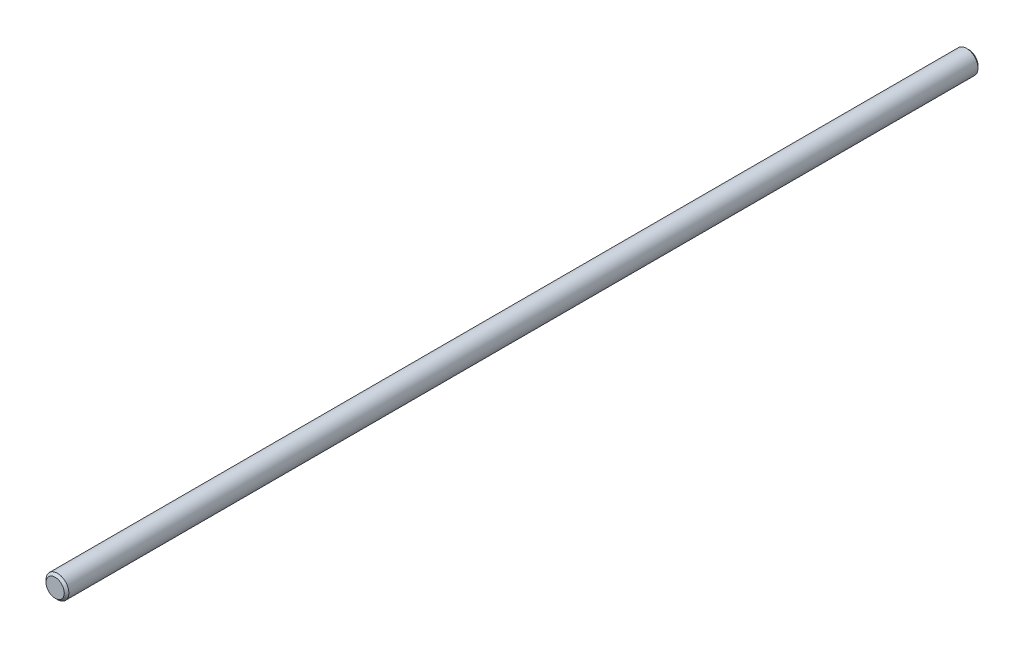
ISO-10303-21;
HEADER;
FILE_DESCRIPTION(('STEP AP214'),'2;1');
FILE_NAME('part.step','',(''),(''),'','','');
FILE_SCHEMA(('AUTOMOTIVE_DESIGN { 1 0 10303 214 1 1 1 1 }'));
ENDSEC;
DATA;
#1=APPLICATION_CONTEXT('core data for automotive mechanical design processes');
#2=APPLICATION_PROTOCOL_DEFINITION('international standard','automotive_design',2000,#1);
#3=PRODUCT_CONTEXT('',#1,'mechanical');
#4=PRODUCT('Part','Part','',(#3));
#5=PRODUCT_RELATED_PRODUCT_CATEGORY('part','',(#4));
#6=PRODUCT_DEFINITION_FORMATION('','',#4);
#7=PRODUCT_DEFINITION_CONTEXT('part definition',#1,'design');
#8=PRODUCT_DEFINITION('design','',#6,#7);
#9=PRODUCT_DEFINITION_SHAPE('','',#8);
#10=(LENGTH_UNIT() NAMED_UNIT(*) SI_UNIT(.MILLI.,.METRE.));
#11=(NAMED_UNIT(*) PLANE_ANGLE_UNIT() SI_UNIT($,.RADIAN.));
#12=(NAMED_UNIT(*) SI_UNIT($,.STERADIAN.) SOLID_ANGLE_UNIT());
#13=UNCERTAINTY_MEASURE_WITH_UNIT(LENGTH_MEASURE(1.E-05),#10,'distance_accuracy_value','');
#14=(GEOMETRIC_REPRESENTATION_CONTEXT(3) GLOBAL_UNCERTAINTY_ASSIGNED_CONTEXT((#13)) GLOBAL_UNIT_ASSIGNED_CONTEXT((#10,
#11,#12)) REPRESENTATION_CONTEXT('',''));
#15=CARTESIAN_POINT('',(0.,0.,0.));
#16=DIRECTION('',(0.,0.,1.));
#17=DIRECTION('',(1.,0.,0.));
#18=AXIS2_PLACEMENT_3D('',#15,#16,#17);
#19=CARTESIAN_POINT('',(0.,0.,63.5));
#20=DIRECTION('',(0.,0.,-1.));
#21=DIRECTION('',(-1.,0.,0.));
#22=AXIS2_PLACEMENT_3D('',#19,#20,#21);
#23=CYLINDRICAL_SURFACE('',#22,1.5875);
#24=CARTESIAN_POINT('',(0.,0.,-63.1825));
#25=DIRECTION('',(0.,0.,1.));
#26=DIRECTION('',(1.,0.,0.));
#27=AXIS2_PLACEMENT_3D('',#24,#25,#26);
#28=CIRCLE('',#27,1.5875);
#29=CARTESIAN_POINT('',(1.5875,0.,-63.1825));
#30=VERTEX_POINT('',#29);
#31=EDGE_CURVE('E48',#30,#30,#28,.T.);
#32=ORIENTED_EDGE('',*,*,#31,.T.);
#33=EDGE_LOOP('',(#32));
#34=FACE_BOUND('',#33,.T.);
#35=CARTESIAN_POINT('',(0.,0.,63.1825));
#36=DIRECTION('',(0.,0.,1.));
#37=DIRECTION('',(1.,0.,0.));
#38=AXIS2_PLACEMENT_3D('',#35,#36,#37);
#39=CIRCLE('',#38,1.5875);
#40=CARTESIAN_POINT('',(1.5875,0.,63.1825));
#41=VERTEX_POINT('',#40);
#42=EDGE_CURVE('E52',#41,#41,#39,.F.);
#43=ORIENTED_EDGE('',*,*,#42,.T.);
#44=EDGE_LOOP('',(#43));
#45=FACE_BOUND('',#44,.T.);
#46=ADVANCED_FACE('F37',(#34,#45),#23,.T.);
#47=CARTESIAN_POINT('',(0.,0.,63.5));
#48=DIRECTION('',(0.,0.,1.));
#49=DIRECTION('',(1.,0.,0.));
#50=AXIS2_PLACEMENT_3D('',#47,#48,#49);
#51=PLANE('',#50);
#52=CARTESIAN_POINT('',(0.,0.,63.5));
#53=DIRECTION('',(0.,0.,1.));
#54=DIRECTION('',(1.,0.,0.));
#55=AXIS2_PLACEMENT_3D('',#52,#53,#54);
#56=CIRCLE('',#55,1.27000000000002);
#57=CARTESIAN_POINT('',(1.27000000000002,0.,63.5));
#58=VERTEX_POINT('',#57);
#59=EDGE_CURVE('E10',#58,#58,#56,.T.);
#60=ORIENTED_EDGE('',*,*,#59,.T.);
#61=EDGE_LOOP('',(#60));
#62=FACE_BOUND('',#61,.T.);
#63=ADVANCED_FACE('F68',(#62),#51,.T.);
#64=CARTESIAN_POINT('',(0.,0.,-63.5));
#65=DIRECTION('',(0.,0.,1.));
#66=DIRECTION('',(1.,0.,0.));
#67=AXIS2_PLACEMENT_3D('',#64,#65,#66);
#68=PLANE('',#67);
#69=CARTESIAN_POINT('',(0.,0.,-63.5));
#70=DIRECTION('',(0.,0.,1.));
#71=DIRECTION('',(1.,0.,0.));
#72=AXIS2_PLACEMENT_3D('',#69,#70,#71);
#73=CIRCLE('',#72,1.26999999999997);
#74=CARTESIAN_POINT('',(1.26999999999997,0.,-63.5));
#75=VERTEX_POINT('',#74);
#76=EDGE_CURVE('E44',#75,#75,#73,.F.);
#77=ORIENTED_EDGE('',*,*,#76,.T.);
#78=EDGE_LOOP('',(#77));
#79=FACE_BOUND('',#78,.T.);
#80=ADVANCED_FACE('F65',(#79),#68,.F.);
#81=CARTESIAN_POINT('',(0.,0.,-63.1825));
#82=DIRECTION('',(0.,0.,1.));
#83=DIRECTION('',(1.,0.,0.));
#84=AXIS2_PLACEMENT_3D('',#81,#82,#83);
#85=CONICAL_SURFACE('',#84,1.5875,0.785398163397461);
#86=ORIENTED_EDGE('',*,*,#76,.F.);
#87=EDGE_LOOP('',(#86));
#88=FACE_BOUND('',#87,.T.);
#89=ORIENTED_EDGE('',*,*,#31,.F.);
#90=EDGE_LOOP('',(#89));
#91=FACE_BOUND('',#90,.T.);
#92=ADVANCED_FACE('F61',(#88,#91),#85,.T.);
#93=CARTESIAN_POINT('',(0.,0.,63.5));
#94=DIRECTION('',(0.,0.,-1.));
#95=DIRECTION('',(-1.,0.,0.));
#96=AXIS2_PLACEMENT_3D('',#93,#94,#95);
#97=CONICAL_SURFACE('',#96,1.27000000000002,0.785398163397439);
#98=ORIENTED_EDGE('',*,*,#42,.F.);
#99=EDGE_LOOP('',(#98));
#100=FACE_BOUND('',#99,.T.);
#101=ORIENTED_EDGE('',*,*,#59,.F.);
#102=EDGE_LOOP('',(#101));
#103=FACE_BOUND('',#102,.T.);
#104=ADVANCED_FACE('F39',(#100,#103),#97,.T.);
#105=CLOSED_SHELL('',(#46,#63,#80,#92,#104));
#106=MANIFOLD_SOLID_BREP('B2',#105);
#107=ADVANCED_BREP_SHAPE_REPRESENTATION('',(#18,#106),#14);
#108=SHAPE_DEFINITION_REPRESENTATION(#9,#107);
ENDSEC;
END-ISO-10303-21;
